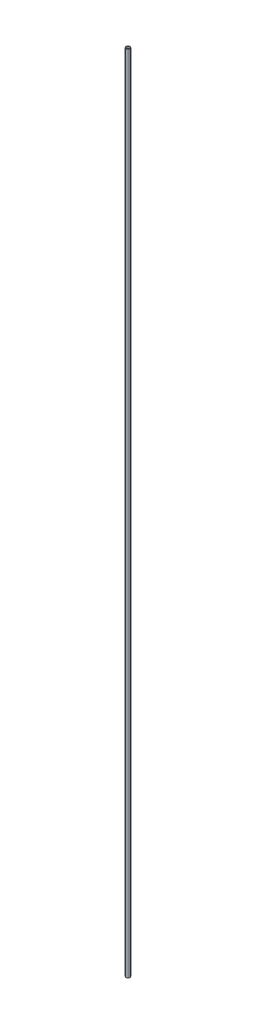
ISO-10303-21;
HEADER;
FILE_DESCRIPTION(('STEP AP214'),'2;1');
FILE_NAME('part.step','',(''),(''),'','','');
FILE_SCHEMA(('AUTOMOTIVE_DESIGN { 1 0 10303 214 1 1 1 1 }'));
ENDSEC;
DATA;
#1=APPLICATION_CONTEXT('core data for automotive mechanical design processes');
#2=APPLICATION_PROTOCOL_DEFINITION('international standard','automotive_design',2000,#1);
#3=PRODUCT_CONTEXT('',#1,'mechanical');
#4=PRODUCT('Part','Part','',(#3));
#5=PRODUCT_RELATED_PRODUCT_CATEGORY('part','',(#4));
#6=PRODUCT_DEFINITION_FORMATION('','',#4);
#7=PRODUCT_DEFINITION_CONTEXT('part definition',#1,'design');
#8=PRODUCT_DEFINITION('design','',#6,#7);
#9=PRODUCT_DEFINITION_SHAPE('','',#8);
#10=(LENGTH_UNIT() NAMED_UNIT(*) SI_UNIT(.MILLI.,.METRE.));
#11=(NAMED_UNIT(*) PLANE_ANGLE_UNIT() SI_UNIT($,.RADIAN.));
#12=(NAMED_UNIT(*) SI_UNIT($,.STERADIAN.) SOLID_ANGLE_UNIT());
#13=UNCERTAINTY_MEASURE_WITH_UNIT(LENGTH_MEASURE(1.E-05),#10,'distance_accuracy_value','');
#14=(GEOMETRIC_REPRESENTATION_CONTEXT(3) GLOBAL_UNCERTAINTY_ASSIGNED_CONTEXT((#13)) GLOBAL_UNIT_ASSIGNED_CONTEXT((#10,
#11,#12)) REPRESENTATION_CONTEXT('',''));
#15=CARTESIAN_POINT('',(0.,0.,0.));
#16=DIRECTION('',(0.,0.,1.));
#17=DIRECTION('',(1.,0.,0.));
#18=AXIS2_PLACEMENT_3D('',#15,#16,#17);
#19=CARTESIAN_POINT('',(0.,0.,0.));
#20=DIRECTION('',(0.,1.,0.));
#21=DIRECTION('',(0.,0.,1.));
#22=AXIS2_PLACEMENT_3D('',#19,#20,#21);
#23=CYLINDRICAL_SURFACE('',#22,2.25);
#24=CARTESIAN_POINT('',(0.,1313.894,0.));
#25=DIRECTION('',(0.,1.,0.));
#26=DIRECTION('',(0.,0.,1.));
#27=AXIS2_PLACEMENT_3D('',#24,#25,#26);
#28=CIRCLE('',#27,2.25);
#29=CARTESIAN_POINT('',(0.,1313.894,2.25));
#30=VERTEX_POINT('',#29);
#31=EDGE_CURVE('E18',#30,#30,#28,.F.);
#32=ORIENTED_EDGE('',*,*,#31,.F.);
#33=EDGE_LOOP('',(#32));
#34=FACE_BOUND('',#33,.T.);
#35=CARTESIAN_POINT('',(0.,14.9,0.));
#36=DIRECTION('',(0.,1.,0.));
#37=DIRECTION('',(0.,0.,1.));
#38=AXIS2_PLACEMENT_3D('',#35,#36,#37);
#39=CIRCLE('',#38,2.25);
#40=CARTESIAN_POINT('',(0.,14.9,2.25));
#41=VERTEX_POINT('',#40);
#42=EDGE_CURVE('E27',#41,#41,#39,.T.);
#43=ORIENTED_EDGE('',*,*,#42,.F.);
#44=EDGE_LOOP('',(#43));
#45=FACE_BOUND('',#44,.T.);
#46=ADVANCED_FACE('F15',(#34,#45),#23,.F.);
#47=CARTESIAN_POINT('',(0.,1313.894,0.));
#48=DIRECTION('',(0.,1.,0.));
#49=DIRECTION('',(0.,0.,1.));
#50=AXIS2_PLACEMENT_3D('',#47,#48,#49);
#51=PLANE('',#50);
#52=ORIENTED_EDGE('',*,*,#31,.T.);
#53=EDGE_LOOP('',(#52));
#54=FACE_BOUND('',#53,.T.);
#55=CARTESIAN_POINT('',(0.,1313.894,0.));
#56=DIRECTION('',(0.,1.,0.));
#57=DIRECTION('',(0.,0.,1.));
#58=AXIS2_PLACEMENT_3D('',#55,#56,#57);
#59=CIRCLE('',#58,3.175);
#60=CARTESIAN_POINT('',(0.,1313.894,3.175));
#61=VERTEX_POINT('',#60);
#62=EDGE_CURVE('E22',#61,#61,#59,.F.);
#63=ORIENTED_EDGE('',*,*,#62,.F.);
#64=EDGE_LOOP('',(#63));
#65=FACE_BOUND('',#64,.T.);
#66=ADVANCED_FACE('F35',(#54,#65),#51,.T.);
#67=CARTESIAN_POINT('',(0.,14.9,0.));
#68=DIRECTION('',(0.,-1.,0.));
#69=DIRECTION('',(0.,0.,-1.));
#70=AXIS2_PLACEMENT_3D('',#67,#68,#69);
#71=PLANE('',#70);
#72=ORIENTED_EDGE('',*,*,#42,.T.);
#73=EDGE_LOOP('',(#72));
#74=FACE_BOUND('',#73,.T.);
#75=CARTESIAN_POINT('',(0.,14.9,0.));
#76=DIRECTION('',(0.,1.,0.));
#77=DIRECTION('',(0.,0.,1.));
#78=AXIS2_PLACEMENT_3D('',#75,#76,#77);
#79=CIRCLE('',#78,3.175);
#80=CARTESIAN_POINT('',(0.,14.9,3.175));
#81=VERTEX_POINT('',#80);
#82=EDGE_CURVE('E10',#81,#81,#79,.T.);
#83=ORIENTED_EDGE('',*,*,#82,.F.);
#84=EDGE_LOOP('',(#83));
#85=FACE_BOUND('',#84,.T.);
#86=ADVANCED_FACE('F44',(#74,#85),#71,.T.);
#87=CARTESIAN_POINT('',(0.,0.,0.));
#88=DIRECTION('',(0.,1.,0.));
#89=DIRECTION('',(0.,0.,1.));
#90=AXIS2_PLACEMENT_3D('',#87,#88,#89);
#91=CYLINDRICAL_SURFACE('',#90,3.175);
#92=ORIENTED_EDGE('',*,*,#62,.T.);
#93=EDGE_LOOP('',(#92));
#94=FACE_BOUND('',#93,.T.);
#95=ORIENTED_EDGE('',*,*,#82,.T.);
#96=EDGE_LOOP('',(#95));
#97=FACE_BOUND('',#96,.T.);
#98=ADVANCED_FACE('F45',(#94,#97),#91,.T.);
#99=CLOSED_SHELL('',(#46,#66,#86,#98));
#100=MANIFOLD_SOLID_BREP('B1',#99);
#101=ADVANCED_BREP_SHAPE_REPRESENTATION('',(#18,#100),#14);
#102=SHAPE_DEFINITION_REPRESENTATION(#9,#101);
ENDSEC;
END-ISO-10303-21;
